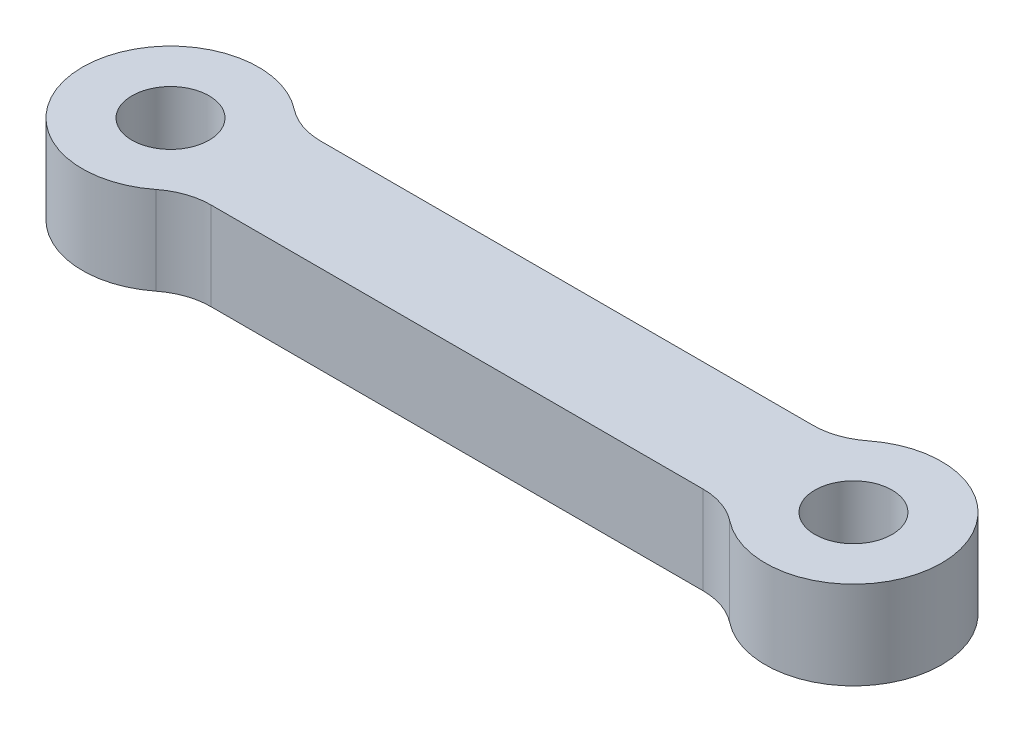
ISO-10303-21;
HEADER;
FILE_DESCRIPTION(('STEP AP214'),'2;1');
FILE_NAME('part.step','',(''),(''),'','','');
FILE_SCHEMA(('AUTOMOTIVE_DESIGN { 1 0 10303 214 1 1 1 1 }'));
ENDSEC;
DATA;
#1=APPLICATION_CONTEXT('core data for automotive mechanical design processes');
#2=APPLICATION_PROTOCOL_DEFINITION('international standard','automotive_design',2000,#1);
#3=PRODUCT_CONTEXT('',#1,'mechanical');
#4=PRODUCT('Part','Part','',(#3));
#5=PRODUCT_RELATED_PRODUCT_CATEGORY('part','',(#4));
#6=PRODUCT_DEFINITION_FORMATION('','',#4);
#7=PRODUCT_DEFINITION_CONTEXT('part definition',#1,'design');
#8=PRODUCT_DEFINITION('design','',#6,#7);
#9=PRODUCT_DEFINITION_SHAPE('','',#8);
#10=(LENGTH_UNIT() NAMED_UNIT(*) SI_UNIT(.MILLI.,.METRE.));
#11=(NAMED_UNIT(*) PLANE_ANGLE_UNIT() SI_UNIT($,.RADIAN.));
#12=(NAMED_UNIT(*) SI_UNIT($,.STERADIAN.) SOLID_ANGLE_UNIT());
#13=UNCERTAINTY_MEASURE_WITH_UNIT(LENGTH_MEASURE(1.E-05),#10,'distance_accuracy_value','');
#14=(GEOMETRIC_REPRESENTATION_CONTEXT(3) GLOBAL_UNCERTAINTY_ASSIGNED_CONTEXT((#13)) GLOBAL_UNIT_ASSIGNED_CONTEXT((#10,
#11,#12)) REPRESENTATION_CONTEXT('',''));
#15=CARTESIAN_POINT('',(0.,0.,0.));
#16=DIRECTION('',(0.,0.,1.));
#17=DIRECTION('',(1.,0.,0.));
#18=AXIS2_PLACEMENT_3D('',#15,#16,#17);
#19=CARTESIAN_POINT('',(3.1224989991992,4.,-2.5));
#20=DIRECTION('',(0.,0.,-1.));
#21=DIRECTION('',(-1.,0.,0.));
#22=AXIS2_PLACEMENT_3D('',#19,#20,#21);
#23=PLANE('',#22);
#24=DIRECTION('',(1.,0.,0.));
#25=VECTOR('',#24,1.);
#26=CARTESIAN_POINT('',(3.1224989991992,0.,-2.5));
#27=LINE('',#26,#25);
#28=CARTESIAN_POINT('',(4.3301270189222,0.,-2.5));
#29=VERTEX_POINT('',#28);
#30=CARTESIAN_POINT('',(26.6698729810778,0.,-2.5));
#31=VERTEX_POINT('',#30);
#32=EDGE_CURVE('E168',#29,#31,#27,.T.);
#33=ORIENTED_EDGE('',*,*,#32,.F.);
#34=DIRECTION('',(0.,-1.,0.));
#35=VECTOR('',#34,1.);
#36=CARTESIAN_POINT('',(4.3301270189222,4.,-2.5));
#37=LINE('',#36,#35);
#38=CARTESIAN_POINT('',(4.3301270189222,4.,-2.5));
#39=VERTEX_POINT('',#38);
#40=EDGE_CURVE('E206',#29,#39,#37,.F.);
#41=ORIENTED_EDGE('',*,*,#40,.T.);
#42=DIRECTION('',(1.,0.,0.));
#43=VECTOR('',#42,1.);
#44=CARTESIAN_POINT('',(3.1224989991992,4.,-2.5));
#45=LINE('',#44,#43);
#46=CARTESIAN_POINT('',(26.6698729810778,4.,-2.5));
#47=VERTEX_POINT('',#46);
#48=EDGE_CURVE('E178',#39,#47,#45,.T.);
#49=ORIENTED_EDGE('',*,*,#48,.T.);
#50=DIRECTION('',(0.,-1.,0.));
#51=VECTOR('',#50,1.);
#52=CARTESIAN_POINT('',(26.6698729810778,4.,-2.5));
#53=LINE('',#52,#51);
#54=EDGE_CURVE('E201',#47,#31,#53,.T.);
#55=ORIENTED_EDGE('',*,*,#54,.T.);
#56=EDGE_LOOP('',(#33,#41,#49,#55));
#57=FACE_BOUND('',#56,.T.);
#58=ADVANCED_FACE('F82',(#57),#23,.T.);
#59=CARTESIAN_POINT('',(3.1224989991992,4.,2.5));
#60=DIRECTION('',(0.,0.,-1.));
#61=DIRECTION('',(-1.,0.,0.));
#62=AXIS2_PLACEMENT_3D('',#59,#60,#61);
#63=PLANE('',#62);
#64=DIRECTION('',(1.,0.,0.));
#65=VECTOR('',#64,1.);
#66=CARTESIAN_POINT('',(3.1224989991992,4.,2.5));
#67=LINE('',#66,#65);
#68=CARTESIAN_POINT('',(4.3301270189222,4.,2.5));
#69=VERTEX_POINT('',#68);
#70=CARTESIAN_POINT('',(26.6698729810778,4.,2.5));
#71=VERTEX_POINT('',#70);
#72=EDGE_CURVE('E163',#69,#71,#67,.T.);
#73=ORIENTED_EDGE('',*,*,#72,.F.);
#74=DIRECTION('',(0.,1.,0.));
#75=VECTOR('',#74,1.);
#76=CARTESIAN_POINT('',(4.3301270189222,0.,2.5));
#77=LINE('',#76,#75);
#78=CARTESIAN_POINT('',(4.3301270189222,0.,2.5));
#79=VERTEX_POINT('',#78);
#80=EDGE_CURVE('E147',#69,#79,#77,.F.);
#81=ORIENTED_EDGE('',*,*,#80,.T.);
#82=DIRECTION('',(1.,0.,0.));
#83=VECTOR('',#82,1.);
#84=CARTESIAN_POINT('',(3.1224989991992,0.,2.5));
#85=LINE('',#84,#83);
#86=CARTESIAN_POINT('',(26.6698729810778,0.,2.5));
#87=VERTEX_POINT('',#86);
#88=EDGE_CURVE('E165',#79,#87,#85,.T.);
#89=ORIENTED_EDGE('',*,*,#88,.T.);
#90=DIRECTION('',(0.,1.,0.));
#91=VECTOR('',#90,1.);
#92=CARTESIAN_POINT('',(26.6698729810778,4.,2.5));
#93=LINE('',#92,#91);
#94=EDGE_CURVE('E167',#87,#71,#93,.T.);
#95=ORIENTED_EDGE('',*,*,#94,.T.);
#96=EDGE_LOOP('',(#73,#81,#89,#95));
#97=FACE_BOUND('',#96,.T.);
#98=ADVANCED_FACE('F161',(#97),#63,.F.);
#99=CARTESIAN_POINT('',(31.0000000000003,0.,0.));
#100=DIRECTION('',(0.,-1.,0.));
#101=DIRECTION('',(0.,0.,-1.));
#102=AXIS2_PLACEMENT_3D('',#99,#100,#101);
#103=PLANE('',#102);
#104=ORIENTED_EDGE('',*,*,#88,.F.);
#105=CARTESIAN_POINT('',(4.3301270189222,0.,5.5));
#106=DIRECTION('',(0.,-1.,0.));
#107=DIRECTION('',(0.,0.,-1.));
#108=AXIS2_PLACEMENT_3D('',#105,#106,#107);
#109=CIRCLE('',#108,3.);
#110=CARTESIAN_POINT('',(2.47435829652697,0.,3.14285714285714));
#111=VERTEX_POINT('',#110);
#112=EDGE_CURVE('E148',#79,#111,#109,.F.);
#113=ORIENTED_EDGE('',*,*,#112,.T.);
#114=CARTESIAN_POINT('',(0.,0.,0.));
#115=DIRECTION('',(0.,1.,0.));
#116=DIRECTION('',(0.,0.,1.));
#117=AXIS2_PLACEMENT_3D('',#114,#115,#116);
#118=CIRCLE('',#117,4.);
#119=CARTESIAN_POINT('',(2.47435829652697,0.,-3.14285714285714));
#120=VERTEX_POINT('',#119);
#121=EDGE_CURVE('E173',#120,#111,#118,.T.);
#122=ORIENTED_EDGE('',*,*,#121,.F.);
#123=CARTESIAN_POINT('',(4.3301270189222,0.,-5.5));
#124=DIRECTION('',(0.,-1.,0.));
#125=DIRECTION('',(0.,0.,-1.));
#126=AXIS2_PLACEMENT_3D('',#123,#124,#125);
#127=CIRCLE('',#126,3.);
#128=EDGE_CURVE('E215',#120,#29,#127,.F.);
#129=ORIENTED_EDGE('',*,*,#128,.T.);
#130=ORIENTED_EDGE('',*,*,#32,.T.);
#131=CARTESIAN_POINT('',(26.6698729810778,0.,-5.5));
#132=DIRECTION('',(0.,-1.,0.));
#133=DIRECTION('',(0.,0.,-1.));
#134=AXIS2_PLACEMENT_3D('',#131,#132,#133);
#135=CIRCLE('',#134,3.);
#136=CARTESIAN_POINT('',(28.5256417034731,0.,-3.14285714285714));
#137=VERTEX_POINT('',#136);
#138=EDGE_CURVE('E96',#31,#137,#135,.F.);
#139=ORIENTED_EDGE('',*,*,#138,.T.);
#140=CARTESIAN_POINT('',(31.,0.,0.));
#141=DIRECTION('',(0.,1.,0.));
#142=DIRECTION('',(0.,0.,1.));
#143=AXIS2_PLACEMENT_3D('',#140,#141,#142);
#144=CIRCLE('',#143,3.99999999999999);
#145=CARTESIAN_POINT('',(28.5256417034731,0.,3.14285714285714));
#146=VERTEX_POINT('',#145);
#147=EDGE_CURVE('E195',#146,#137,#144,.T.);
#148=ORIENTED_EDGE('',*,*,#147,.F.);
#149=CARTESIAN_POINT('',(26.6698729810778,0.,5.5));
#150=DIRECTION('',(0.,-1.,0.));
#151=DIRECTION('',(0.,0.,-1.));
#152=AXIS2_PLACEMENT_3D('',#149,#150,#151);
#153=CIRCLE('',#152,3.);
#154=EDGE_CURVE('E90',#146,#87,#153,.F.);
#155=ORIENTED_EDGE('',*,*,#154,.T.);
#156=EDGE_LOOP('',(#104,#113,#122,#129,#130,#139,#148,#155));
#157=FACE_BOUND('',#156,.T.);
#158=CARTESIAN_POINT('',(0.,0.,0.));
#159=DIRECTION('',(0.,1.,0.));
#160=DIRECTION('',(0.,0.,1.));
#161=AXIS2_PLACEMENT_3D('',#158,#159,#160);
#162=CIRCLE('',#161,1.75);
#163=CARTESIAN_POINT('',(0.,0.,1.75));
#164=VERTEX_POINT('',#163);
#165=EDGE_CURVE('E184',#164,#164,#162,.T.);
#166=ORIENTED_EDGE('',*,*,#165,.T.);
#167=EDGE_LOOP('',(#166));
#168=FACE_BOUND('',#167,.T.);
#169=CARTESIAN_POINT('',(31.,0.,0.));
#170=DIRECTION('',(0.,1.,0.));
#171=DIRECTION('',(0.,0.,1.));
#172=AXIS2_PLACEMENT_3D('',#169,#170,#171);
#173=CIRCLE('',#172,1.74999999999999);
#174=CARTESIAN_POINT('',(31.,0.,1.74999999999999));
#175=VERTEX_POINT('',#174);
#176=EDGE_CURVE('E193',#175,#175,#173,.T.);
#177=ORIENTED_EDGE('',*,*,#176,.T.);
#178=EDGE_LOOP('',(#177));
#179=FACE_BOUND('',#178,.T.);
#180=ADVANCED_FACE('F169',(#157,#168,#179),#103,.T.);
#181=CARTESIAN_POINT('',(31.0000000000003,4.,0.));
#182=DIRECTION('',(0.,-1.,0.));
#183=DIRECTION('',(0.,0.,-1.));
#184=AXIS2_PLACEMENT_3D('',#181,#182,#183);
#185=PLANE('',#184);
#186=CARTESIAN_POINT('',(0.,4.,0.));
#187=DIRECTION('',(0.,1.,0.));
#188=DIRECTION('',(0.,0.,1.));
#189=AXIS2_PLACEMENT_3D('',#186,#187,#188);
#190=CIRCLE('',#189,4.);
#191=CARTESIAN_POINT('',(2.47435829652697,4.,-3.14285714285714));
#192=VERTEX_POINT('',#191);
#193=CARTESIAN_POINT('',(2.47435829652697,4.,3.14285714285714));
#194=VERTEX_POINT('',#193);
#195=EDGE_CURVE('E172',#192,#194,#190,.T.);
#196=ORIENTED_EDGE('',*,*,#195,.T.);
#197=CARTESIAN_POINT('',(4.3301270189222,4.,5.5));
#198=DIRECTION('',(0.,-1.,0.));
#199=DIRECTION('',(0.,0.,-1.));
#200=AXIS2_PLACEMENT_3D('',#197,#198,#199);
#201=CIRCLE('',#200,3.);
#202=EDGE_CURVE('E154',#194,#69,#201,.T.);
#203=ORIENTED_EDGE('',*,*,#202,.T.);
#204=ORIENTED_EDGE('',*,*,#72,.T.);
#205=CARTESIAN_POINT('',(26.6698729810778,4.,5.5));
#206=DIRECTION('',(0.,-1.,0.));
#207=DIRECTION('',(0.,0.,-1.));
#208=AXIS2_PLACEMENT_3D('',#205,#206,#207);
#209=CIRCLE('',#208,3.);
#210=CARTESIAN_POINT('',(28.5256417034731,4.,3.14285714285714));
#211=VERTEX_POINT('',#210);
#212=EDGE_CURVE('E12',#71,#211,#209,.T.);
#213=ORIENTED_EDGE('',*,*,#212,.T.);
#214=CARTESIAN_POINT('',(31.,4.,0.));
#215=DIRECTION('',(0.,1.,0.));
#216=DIRECTION('',(0.,0.,1.));
#217=AXIS2_PLACEMENT_3D('',#214,#215,#216);
#218=CIRCLE('',#217,3.99999999999999);
#219=CARTESIAN_POINT('',(28.5256417034731,4.,-3.14285714285714));
#220=VERTEX_POINT('',#219);
#221=EDGE_CURVE('E187',#211,#220,#218,.T.);
#222=ORIENTED_EDGE('',*,*,#221,.T.);
#223=CARTESIAN_POINT('',(26.6698729810778,4.,-5.5));
#224=DIRECTION('',(0.,-1.,0.));
#225=DIRECTION('',(0.,0.,-1.));
#226=AXIS2_PLACEMENT_3D('',#223,#224,#225);
#227=CIRCLE('',#226,3.);
#228=EDGE_CURVE('E220',#220,#47,#227,.T.);
#229=ORIENTED_EDGE('',*,*,#228,.T.);
#230=ORIENTED_EDGE('',*,*,#48,.F.);
#231=CARTESIAN_POINT('',(4.3301270189222,4.,-5.5));
#232=DIRECTION('',(0.,-1.,0.));
#233=DIRECTION('',(0.,0.,-1.));
#234=AXIS2_PLACEMENT_3D('',#231,#232,#233);
#235=CIRCLE('',#234,3.);
#236=EDGE_CURVE('E212',#39,#192,#235,.T.);
#237=ORIENTED_EDGE('',*,*,#236,.T.);
#238=EDGE_LOOP('',(#196,#203,#204,#213,#222,#229,#230,#237));
#239=FACE_BOUND('',#238,.T.);
#240=CARTESIAN_POINT('',(0.,4.,0.));
#241=DIRECTION('',(0.,1.,0.));
#242=DIRECTION('',(0.,0.,1.));
#243=AXIS2_PLACEMENT_3D('',#240,#241,#242);
#244=CIRCLE('',#243,1.75);
#245=CARTESIAN_POINT('',(0.,4.,1.75));
#246=VERTEX_POINT('',#245);
#247=EDGE_CURVE('E182',#246,#246,#244,.T.);
#248=ORIENTED_EDGE('',*,*,#247,.F.);
#249=EDGE_LOOP('',(#248));
#250=FACE_BOUND('',#249,.T.);
#251=CARTESIAN_POINT('',(31.,4.,0.));
#252=DIRECTION('',(0.,1.,0.));
#253=DIRECTION('',(0.,0.,1.));
#254=AXIS2_PLACEMENT_3D('',#251,#252,#253);
#255=CIRCLE('',#254,1.74999999999999);
#256=CARTESIAN_POINT('',(31.,4.,1.74999999999999));
#257=VERTEX_POINT('',#256);
#258=EDGE_CURVE('E186',#257,#257,#255,.T.);
#259=ORIENTED_EDGE('',*,*,#258,.F.);
#260=EDGE_LOOP('',(#259));
#261=FACE_BOUND('',#260,.T.);
#262=ADVANCED_FACE('F225',(#239,#250,#261),#185,.F.);
#263=CARTESIAN_POINT('',(31.,4.,0.));
#264=DIRECTION('',(0.,-1.,0.));
#265=DIRECTION('',(0.,0.,-1.));
#266=AXIS2_PLACEMENT_3D('',#263,#264,#265);
#267=CYLINDRICAL_SURFACE('',#266,1.74999999999999);
#268=ORIENTED_EDGE('',*,*,#258,.T.);
#269=EDGE_LOOP('',(#268));
#270=FACE_BOUND('',#269,.T.);
#271=ORIENTED_EDGE('',*,*,#176,.F.);
#272=EDGE_LOOP('',(#271));
#273=FACE_BOUND('',#272,.T.);
#274=ADVANCED_FACE('F253',(#270,#273),#267,.F.);
#275=CARTESIAN_POINT('',(31.,4.,0.));
#276=DIRECTION('',(0.,-1.,0.));
#277=DIRECTION('',(0.,0.,-1.));
#278=AXIS2_PLACEMENT_3D('',#275,#276,#277);
#279=CYLINDRICAL_SURFACE('',#278,3.99999999999999);
#280=ORIENTED_EDGE('',*,*,#147,.T.);
#281=DIRECTION('',(0.,-1.,0.));
#282=VECTOR('',#281,1.);
#283=CARTESIAN_POINT('',(28.5256417034731,4.,-3.14285714285714));
#284=LINE('',#283,#282);
#285=EDGE_CURVE('E156',#137,#220,#284,.F.);
#286=ORIENTED_EDGE('',*,*,#285,.T.);
#287=ORIENTED_EDGE('',*,*,#221,.F.);
#288=DIRECTION('',(0.,-1.,0.));
#289=VECTOR('',#288,1.);
#290=CARTESIAN_POINT('',(28.5256417034731,4.,3.14285714285714));
#291=LINE('',#290,#289);
#292=EDGE_CURVE('E208',#211,#146,#291,.T.);
#293=ORIENTED_EDGE('',*,*,#292,.T.);
#294=EDGE_LOOP('',(#280,#286,#287,#293));
#295=FACE_BOUND('',#294,.T.);
#296=ADVANCED_FACE('F234',(#295),#279,.T.);
#297=CARTESIAN_POINT('',(0.,4.,0.));
#298=DIRECTION('',(0.,-1.,0.));
#299=DIRECTION('',(0.,0.,-1.));
#300=AXIS2_PLACEMENT_3D('',#297,#298,#299);
#301=CYLINDRICAL_SURFACE('',#300,1.75);
#302=ORIENTED_EDGE('',*,*,#247,.T.);
#303=EDGE_LOOP('',(#302));
#304=FACE_BOUND('',#303,.T.);
#305=ORIENTED_EDGE('',*,*,#165,.F.);
#306=EDGE_LOOP('',(#305));
#307=FACE_BOUND('',#306,.T.);
#308=ADVANCED_FACE('F249',(#304,#307),#301,.F.);
#309=CARTESIAN_POINT('',(0.,4.,0.));
#310=DIRECTION('',(0.,-1.,0.));
#311=DIRECTION('',(0.,0.,-1.));
#312=AXIS2_PLACEMENT_3D('',#309,#310,#311);
#313=CYLINDRICAL_SURFACE('',#312,4.);
#314=ORIENTED_EDGE('',*,*,#121,.T.);
#315=DIRECTION('',(0.,-1.,0.));
#316=VECTOR('',#315,1.);
#317=CARTESIAN_POINT('',(2.47435829652697,4.,3.14285714285715));
#318=LINE('',#317,#316);
#319=EDGE_CURVE('E151',#111,#194,#318,.F.);
#320=ORIENTED_EDGE('',*,*,#319,.T.);
#321=ORIENTED_EDGE('',*,*,#195,.F.);
#322=DIRECTION('',(0.,-1.,0.));
#323=VECTOR('',#322,1.);
#324=CARTESIAN_POINT('',(2.47435829652697,4.,-3.14285714285715));
#325=LINE('',#324,#323);
#326=EDGE_CURVE('E164',#192,#120,#325,.T.);
#327=ORIENTED_EDGE('',*,*,#326,.T.);
#328=EDGE_LOOP('',(#314,#320,#321,#327));
#329=FACE_BOUND('',#328,.T.);
#330=ADVANCED_FACE('F239',(#329),#313,.T.);
#331=CARTESIAN_POINT('',(4.3301270189222,4.,5.5));
#332=DIRECTION('',(0.,-1.,0.));
#333=DIRECTION('',(0.,0.,-1.));
#334=AXIS2_PLACEMENT_3D('',#331,#332,#333);
#335=CYLINDRICAL_SURFACE('',#334,3.);
#336=ORIENTED_EDGE('',*,*,#202,.F.);
#337=ORIENTED_EDGE('',*,*,#319,.F.);
#338=ORIENTED_EDGE('',*,*,#112,.F.);
#339=ORIENTED_EDGE('',*,*,#80,.F.);
#340=EDGE_LOOP('',(#336,#337,#338,#339));
#341=FACE_BOUND('',#340,.T.);
#342=ADVANCED_FACE('F149',(#341),#335,.F.);
#343=CARTESIAN_POINT('',(4.3301270189222,4.,-5.5));
#344=DIRECTION('',(0.,-1.,0.));
#345=DIRECTION('',(0.,0.,-1.));
#346=AXIS2_PLACEMENT_3D('',#343,#344,#345);
#347=CYLINDRICAL_SURFACE('',#346,3.);
#348=ORIENTED_EDGE('',*,*,#236,.F.);
#349=ORIENTED_EDGE('',*,*,#40,.F.);
#350=ORIENTED_EDGE('',*,*,#128,.F.);
#351=ORIENTED_EDGE('',*,*,#326,.F.);
#352=EDGE_LOOP('',(#348,#349,#350,#351));
#353=FACE_BOUND('',#352,.T.);
#354=ADVANCED_FACE('F242',(#353),#347,.F.);
#355=CARTESIAN_POINT('',(26.6698729810778,4.,-5.5));
#356=DIRECTION('',(0.,-1.,0.));
#357=DIRECTION('',(0.,0.,-1.));
#358=AXIS2_PLACEMENT_3D('',#355,#356,#357);
#359=CYLINDRICAL_SURFACE('',#358,3.);
#360=ORIENTED_EDGE('',*,*,#228,.F.);
#361=ORIENTED_EDGE('',*,*,#285,.F.);
#362=ORIENTED_EDGE('',*,*,#138,.F.);
#363=ORIENTED_EDGE('',*,*,#54,.F.);
#364=EDGE_LOOP('',(#360,#361,#362,#363));
#365=FACE_BOUND('',#364,.T.);
#366=ADVANCED_FACE('F235',(#365),#359,.F.);
#367=CARTESIAN_POINT('',(26.6698729810778,4.,5.5));
#368=DIRECTION('',(0.,-1.,0.));
#369=DIRECTION('',(0.,0.,-1.));
#370=AXIS2_PLACEMENT_3D('',#367,#368,#369);
#371=CYLINDRICAL_SURFACE('',#370,3.);
#372=ORIENTED_EDGE('',*,*,#212,.F.);
#373=ORIENTED_EDGE('',*,*,#94,.F.);
#374=ORIENTED_EDGE('',*,*,#154,.F.);
#375=ORIENTED_EDGE('',*,*,#292,.F.);
#376=EDGE_LOOP('',(#372,#373,#374,#375));
#377=FACE_BOUND('',#376,.T.);
#378=ADVANCED_FACE('F83',(#377),#371,.F.);
#379=CLOSED_SHELL('',(#58,#98,#180,#262,#274,#296,#308,#330,#342,#354,#366,#378));
#380=MANIFOLD_SOLID_BREP('B2',#379);
#381=ADVANCED_BREP_SHAPE_REPRESENTATION('',(#18,#380),#14);
#382=SHAPE_DEFINITION_REPRESENTATION(#9,#381);
ENDSEC;
END-ISO-10303-21;
